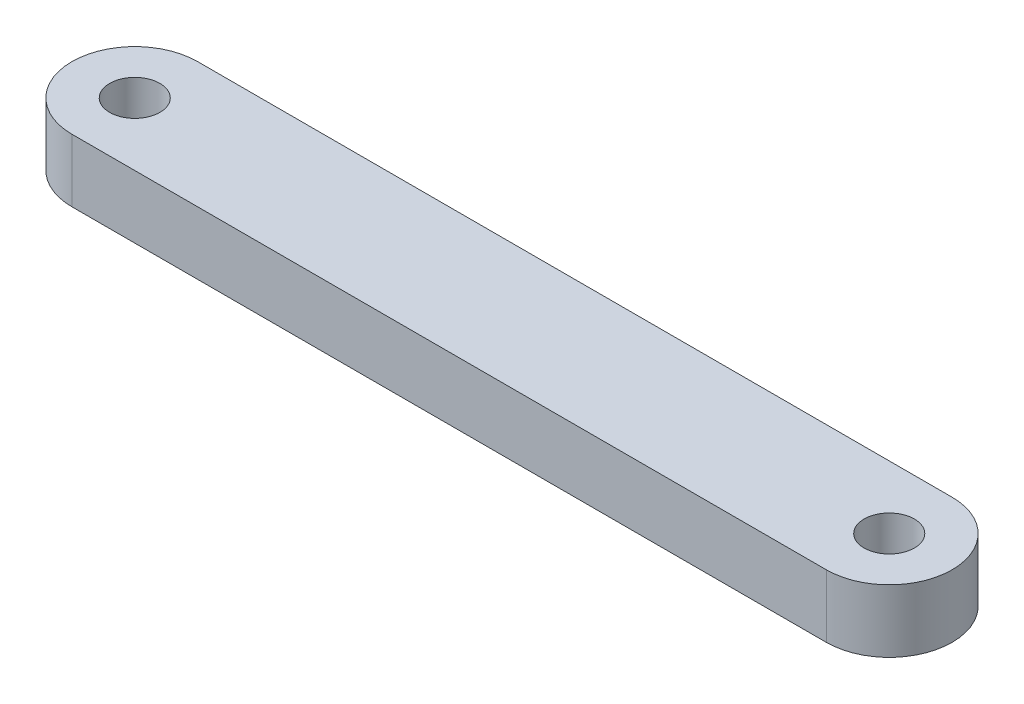
ISO-10303-21;
HEADER;
FILE_DESCRIPTION(('STEP AP214'),'2;1');
FILE_NAME('part.step','',(''),(''),'','','');
FILE_SCHEMA(('AUTOMOTIVE_DESIGN { 1 0 10303 214 1 1 1 1 }'));
ENDSEC;
DATA;
#1=APPLICATION_CONTEXT('core data for automotive mechanical design processes');
#2=APPLICATION_PROTOCOL_DEFINITION('international standard','automotive_design',2000,#1);
#3=PRODUCT_CONTEXT('',#1,'mechanical');
#4=PRODUCT('Part','Part','',(#3));
#5=PRODUCT_RELATED_PRODUCT_CATEGORY('part','',(#4));
#6=PRODUCT_DEFINITION_FORMATION('','',#4);
#7=PRODUCT_DEFINITION_CONTEXT('part definition',#1,'design');
#8=PRODUCT_DEFINITION('design','',#6,#7);
#9=PRODUCT_DEFINITION_SHAPE('','',#8);
#10=(LENGTH_UNIT() NAMED_UNIT(*) SI_UNIT(.MILLI.,.METRE.));
#11=(NAMED_UNIT(*) PLANE_ANGLE_UNIT() SI_UNIT($,.RADIAN.));
#12=(NAMED_UNIT(*) SI_UNIT($,.STERADIAN.) SOLID_ANGLE_UNIT());
#13=UNCERTAINTY_MEASURE_WITH_UNIT(LENGTH_MEASURE(1.E-05),#10,'distance_accuracy_value','');
#14=(GEOMETRIC_REPRESENTATION_CONTEXT(3) GLOBAL_UNCERTAINTY_ASSIGNED_CONTEXT((#13)) GLOBAL_UNIT_ASSIGNED_CONTEXT((#10,
#11,#12)) REPRESENTATION_CONTEXT('',''));
#15=CARTESIAN_POINT('',(0.,0.,0.));
#16=DIRECTION('',(0.,0.,1.));
#17=DIRECTION('',(1.,0.,0.));
#18=AXIS2_PLACEMENT_3D('',#15,#16,#17);
#19=CARTESIAN_POINT('',(0.,5.,0.));
#20=DIRECTION('',(0.,1.,0.));
#21=DIRECTION('',(0.,0.,1.));
#22=AXIS2_PLACEMENT_3D('',#19,#20,#21);
#23=PLANE('',#22);
#24=CARTESIAN_POINT('',(0.,5.,0.));
#25=DIRECTION('',(0.,1.,0.));
#26=DIRECTION('',(0.,0.,1.));
#27=AXIS2_PLACEMENT_3D('',#24,#25,#26);
#28=CIRCLE('',#27,2.);
#29=CARTESIAN_POINT('',(0.,5.,2.));
#30=VERTEX_POINT('',#29);
#31=EDGE_CURVE('E100',#30,#30,#28,.T.);
#32=ORIENTED_EDGE('',*,*,#31,.F.);
#33=EDGE_LOOP('',(#32));
#34=FACE_BOUND('',#33,.T.);
#35=CARTESIAN_POINT('',(0.,5.,0.));
#36=DIRECTION('',(0.,1.,0.));
#37=DIRECTION('',(0.,0.,1.));
#38=AXIS2_PLACEMENT_3D('',#35,#36,#37);
#39=CIRCLE('',#38,5.);
#40=CARTESIAN_POINT('',(0.,5.,-5.));
#41=VERTEX_POINT('',#40);
#42=CARTESIAN_POINT('',(0.,5.,5.));
#43=VERTEX_POINT('',#42);
#44=EDGE_CURVE('E85',#41,#43,#39,.T.);
#45=ORIENTED_EDGE('',*,*,#44,.T.);
#46=DIRECTION('',(1.,0.,0.));
#47=VECTOR('',#46,1.);
#48=CARTESIAN_POINT('',(0.,5.,5.));
#49=LINE('',#48,#47);
#50=CARTESIAN_POINT('',(60.,5.,5.));
#51=VERTEX_POINT('',#50);
#52=EDGE_CURVE('E80',#43,#51,#49,.T.);
#53=ORIENTED_EDGE('',*,*,#52,.T.);
#54=CARTESIAN_POINT('',(60.,5.,0.));
#55=DIRECTION('',(0.,1.,0.));
#56=DIRECTION('',(0.,0.,1.));
#57=AXIS2_PLACEMENT_3D('',#54,#55,#56);
#58=CIRCLE('',#57,5.);
#59=CARTESIAN_POINT('',(60.,5.,-5.));
#60=VERTEX_POINT('',#59);
#61=EDGE_CURVE('E83',#51,#60,#58,.T.);
#62=ORIENTED_EDGE('',*,*,#61,.T.);
#63=DIRECTION('',(-1.,0.,0.));
#64=VECTOR('',#63,1.);
#65=CARTESIAN_POINT('',(0.,5.,-5.));
#66=LINE('',#65,#64);
#67=EDGE_CURVE('E50',#60,#41,#66,.T.);
#68=ORIENTED_EDGE('',*,*,#67,.T.);
#69=EDGE_LOOP('',(#45,#53,#62,#68));
#70=FACE_BOUND('',#69,.T.);
#71=CARTESIAN_POINT('',(60.,5.,0.));
#72=DIRECTION('',(0.,1.,0.));
#73=DIRECTION('',(0.,0.,1.));
#74=AXIS2_PLACEMENT_3D('',#71,#72,#73);
#75=CIRCLE('',#74,2.);
#76=CARTESIAN_POINT('',(60.,5.,2.));
#77=VERTEX_POINT('',#76);
#78=EDGE_CURVE('E115',#77,#77,#75,.T.);
#79=ORIENTED_EDGE('',*,*,#78,.F.);
#80=EDGE_LOOP('',(#79));
#81=FACE_BOUND('',#80,.T.);
#82=ADVANCED_FACE('F33',(#34,#70,#81),#23,.T.);
#83=CARTESIAN_POINT('',(0.,0.,0.));
#84=DIRECTION('',(0.,1.,0.));
#85=DIRECTION('',(0.,0.,1.));
#86=AXIS2_PLACEMENT_3D('',#83,#84,#85);
#87=PLANE('',#86);
#88=CARTESIAN_POINT('',(0.,0.,0.));
#89=DIRECTION('',(0.,1.,0.));
#90=DIRECTION('',(0.,0.,1.));
#91=AXIS2_PLACEMENT_3D('',#88,#89,#90);
#92=CIRCLE('',#91,2.);
#93=CARTESIAN_POINT('',(0.,0.,2.));
#94=VERTEX_POINT('',#93);
#95=EDGE_CURVE('E112',#94,#94,#92,.T.);
#96=ORIENTED_EDGE('',*,*,#95,.T.);
#97=EDGE_LOOP('',(#96));
#98=FACE_BOUND('',#97,.T.);
#99=CARTESIAN_POINT('',(0.,0.,0.));
#100=DIRECTION('',(0.,1.,0.));
#101=DIRECTION('',(0.,0.,1.));
#102=AXIS2_PLACEMENT_3D('',#99,#100,#101);
#103=CIRCLE('',#102,5.);
#104=CARTESIAN_POINT('',(0.,0.,-5.));
#105=VERTEX_POINT('',#104);
#106=CARTESIAN_POINT('',(0.,0.,5.));
#107=VERTEX_POINT('',#106);
#108=EDGE_CURVE('E97',#105,#107,#103,.T.);
#109=ORIENTED_EDGE('',*,*,#108,.F.);
#110=DIRECTION('',(-1.,0.,0.));
#111=VECTOR('',#110,1.);
#112=CARTESIAN_POINT('',(0.,0.,-5.));
#113=LINE('',#112,#111);
#114=CARTESIAN_POINT('',(60.,0.,-5.));
#115=VERTEX_POINT('',#114);
#116=EDGE_CURVE('E73',#115,#105,#113,.T.);
#117=ORIENTED_EDGE('',*,*,#116,.F.);
#118=CARTESIAN_POINT('',(60.,0.,0.));
#119=DIRECTION('',(0.,1.,0.));
#120=DIRECTION('',(0.,0.,1.));
#121=AXIS2_PLACEMENT_3D('',#118,#119,#120);
#122=CIRCLE('',#121,5.);
#123=CARTESIAN_POINT('',(60.,0.,5.));
#124=VERTEX_POINT('',#123);
#125=EDGE_CURVE('E67',#124,#115,#122,.T.);
#126=ORIENTED_EDGE('',*,*,#125,.F.);
#127=DIRECTION('',(1.,0.,0.));
#128=VECTOR('',#127,1.);
#129=CARTESIAN_POINT('',(0.,0.,5.));
#130=LINE('',#129,#128);
#131=EDGE_CURVE('E89',#107,#124,#130,.T.);
#132=ORIENTED_EDGE('',*,*,#131,.F.);
#133=EDGE_LOOP('',(#109,#117,#126,#132));
#134=FACE_BOUND('',#133,.T.);
#135=CARTESIAN_POINT('',(60.,0.,0.));
#136=DIRECTION('',(0.,1.,0.));
#137=DIRECTION('',(0.,0.,1.));
#138=AXIS2_PLACEMENT_3D('',#135,#136,#137);
#139=CIRCLE('',#138,2.);
#140=CARTESIAN_POINT('',(60.,0.,2.));
#141=VERTEX_POINT('',#140);
#142=EDGE_CURVE('E118',#141,#141,#139,.T.);
#143=ORIENTED_EDGE('',*,*,#142,.T.);
#144=EDGE_LOOP('',(#143));
#145=FACE_BOUND('',#144,.T.);
#146=ADVANCED_FACE('F108',(#98,#134,#145),#87,.F.);
#147=CARTESIAN_POINT('',(0.,5.,0.));
#148=DIRECTION('',(0.,-1.,0.));
#149=DIRECTION('',(0.,0.,-1.));
#150=AXIS2_PLACEMENT_3D('',#147,#148,#149);
#151=CYLINDRICAL_SURFACE('',#150,5.);
#152=ORIENTED_EDGE('',*,*,#108,.T.);
#153=DIRECTION('',(0.,-1.,0.));
#154=VECTOR('',#153,1.);
#155=CARTESIAN_POINT('',(0.,5.,5.));
#156=LINE('',#155,#154);
#157=EDGE_CURVE('E11',#43,#107,#156,.T.);
#158=ORIENTED_EDGE('',*,*,#157,.F.);
#159=ORIENTED_EDGE('',*,*,#44,.F.);
#160=DIRECTION('',(0.,-1.,0.));
#161=VECTOR('',#160,1.);
#162=CARTESIAN_POINT('',(0.,5.,-5.));
#163=LINE('',#162,#161);
#164=EDGE_CURVE('E93',#41,#105,#163,.T.);
#165=ORIENTED_EDGE('',*,*,#164,.T.);
#166=EDGE_LOOP('',(#152,#158,#159,#165));
#167=FACE_BOUND('',#166,.T.);
#168=ADVANCED_FACE('F35',(#167),#151,.T.);
#169=CARTESIAN_POINT('',(0.,5.,5.));
#170=DIRECTION('',(0.,0.,-1.));
#171=DIRECTION('',(-1.,0.,0.));
#172=AXIS2_PLACEMENT_3D('',#169,#170,#171);
#173=PLANE('',#172);
#174=ORIENTED_EDGE('',*,*,#131,.T.);
#175=DIRECTION('',(0.,-1.,0.));
#176=VECTOR('',#175,1.);
#177=CARTESIAN_POINT('',(60.,5.,5.));
#178=LINE('',#177,#176);
#179=EDGE_CURVE('E42',#51,#124,#178,.T.);
#180=ORIENTED_EDGE('',*,*,#179,.F.);
#181=ORIENTED_EDGE('',*,*,#52,.F.);
#182=ORIENTED_EDGE('',*,*,#157,.T.);
#183=EDGE_LOOP('',(#174,#180,#181,#182));
#184=FACE_BOUND('',#183,.T.);
#185=ADVANCED_FACE('F88',(#184),#173,.F.);
#186=CARTESIAN_POINT('',(60.,5.,0.));
#187=DIRECTION('',(0.,-1.,0.));
#188=DIRECTION('',(0.,0.,-1.));
#189=AXIS2_PLACEMENT_3D('',#186,#187,#188);
#190=CYLINDRICAL_SURFACE('',#189,5.);
#191=ORIENTED_EDGE('',*,*,#125,.T.);
#192=DIRECTION('',(0.,-1.,0.));
#193=VECTOR('',#192,1.);
#194=CARTESIAN_POINT('',(60.,5.,-5.));
#195=LINE('',#194,#193);
#196=EDGE_CURVE('E90',#60,#115,#195,.T.);
#197=ORIENTED_EDGE('',*,*,#196,.F.);
#198=ORIENTED_EDGE('',*,*,#61,.F.);
#199=ORIENTED_EDGE('',*,*,#179,.T.);
#200=EDGE_LOOP('',(#191,#197,#198,#199));
#201=FACE_BOUND('',#200,.T.);
#202=ADVANCED_FACE('F91',(#201),#190,.T.);
#203=CARTESIAN_POINT('',(0.,5.,-5.));
#204=DIRECTION('',(0.,0.,1.));
#205=DIRECTION('',(1.,0.,0.));
#206=AXIS2_PLACEMENT_3D('',#203,#204,#205);
#207=PLANE('',#206);
#208=ORIENTED_EDGE('',*,*,#116,.T.);
#209=ORIENTED_EDGE('',*,*,#164,.F.);
#210=ORIENTED_EDGE('',*,*,#67,.F.);
#211=ORIENTED_EDGE('',*,*,#196,.T.);
#212=EDGE_LOOP('',(#208,#209,#210,#211));
#213=FACE_BOUND('',#212,.T.);
#214=ADVANCED_FACE('F105',(#213),#207,.F.);
#215=CARTESIAN_POINT('',(0.,5.,0.));
#216=DIRECTION('',(0.,-1.,0.));
#217=DIRECTION('',(0.,0.,-1.));
#218=AXIS2_PLACEMENT_3D('',#215,#216,#217);
#219=CYLINDRICAL_SURFACE('',#218,2.);
#220=ORIENTED_EDGE('',*,*,#31,.T.);
#221=EDGE_LOOP('',(#220));
#222=FACE_BOUND('',#221,.T.);
#223=ORIENTED_EDGE('',*,*,#95,.F.);
#224=EDGE_LOOP('',(#223));
#225=FACE_BOUND('',#224,.T.);
#226=ADVANCED_FACE('F136',(#222,#225),#219,.F.);
#227=CARTESIAN_POINT('',(60.,5.,0.));
#228=DIRECTION('',(0.,-1.,0.));
#229=DIRECTION('',(0.,0.,-1.));
#230=AXIS2_PLACEMENT_3D('',#227,#228,#229);
#231=CYLINDRICAL_SURFACE('',#230,2.);
#232=ORIENTED_EDGE('',*,*,#78,.T.);
#233=EDGE_LOOP('',(#232));
#234=FACE_BOUND('',#233,.T.);
#235=ORIENTED_EDGE('',*,*,#142,.F.);
#236=EDGE_LOOP('',(#235));
#237=FACE_BOUND('',#236,.T.);
#238=ADVANCED_FACE('F124',(#234,#237),#231,.F.);
#239=CLOSED_SHELL('',(#82,#146,#168,#185,#202,#214,#226,#238));
#240=MANIFOLD_SOLID_BREP('B2',#239);
#241=ADVANCED_BREP_SHAPE_REPRESENTATION('',(#18,#240),#14);
#242=SHAPE_DEFINITION_REPRESENTATION(#9,#241);
ENDSEC;
END-ISO-10303-21;
